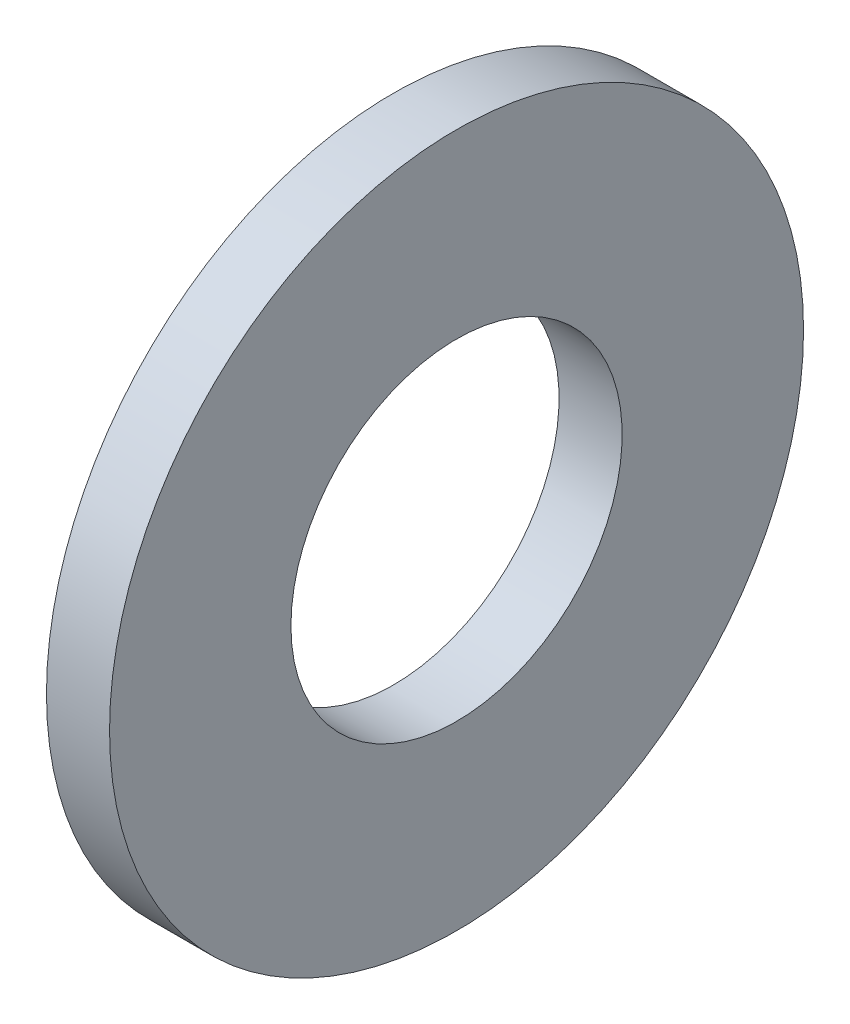
ISO-10303-21;
HEADER;
FILE_DESCRIPTION(('STEP AP214'),'2;1');
FILE_NAME('part.step','',(''),(''),'','','');
FILE_SCHEMA(('AUTOMOTIVE_DESIGN { 1 0 10303 214 1 1 1 1 }'));
ENDSEC;
DATA;
#1=APPLICATION_CONTEXT('core data for automotive mechanical design processes');
#2=APPLICATION_PROTOCOL_DEFINITION('international standard','automotive_design',2000,#1);
#3=PRODUCT_CONTEXT('',#1,'mechanical');
#4=PRODUCT('Part','Part','',(#3));
#5=PRODUCT_RELATED_PRODUCT_CATEGORY('part','',(#4));
#6=PRODUCT_DEFINITION_FORMATION('','',#4);
#7=PRODUCT_DEFINITION_CONTEXT('part definition',#1,'design');
#8=PRODUCT_DEFINITION('design','',#6,#7);
#9=PRODUCT_DEFINITION_SHAPE('','',#8);
#10=(LENGTH_UNIT() NAMED_UNIT(*) SI_UNIT(.MILLI.,.METRE.));
#11=(NAMED_UNIT(*) PLANE_ANGLE_UNIT() SI_UNIT($,.RADIAN.));
#12=(NAMED_UNIT(*) SI_UNIT($,.STERADIAN.) SOLID_ANGLE_UNIT());
#13=UNCERTAINTY_MEASURE_WITH_UNIT(LENGTH_MEASURE(1.E-05),#10,'distance_accuracy_value','');
#14=(GEOMETRIC_REPRESENTATION_CONTEXT(3) GLOBAL_UNCERTAINTY_ASSIGNED_CONTEXT((#13)) GLOBAL_UNIT_ASSIGNED_CONTEXT((#10,
#11,#12)) REPRESENTATION_CONTEXT('',''));
#15=CARTESIAN_POINT('',(0.,0.,0.));
#16=DIRECTION('',(0.,0.,1.));
#17=DIRECTION('',(1.,0.,0.));
#18=AXIS2_PLACEMENT_3D('',#15,#16,#17);
#19=CARTESIAN_POINT('',(0.,0.,-11.));
#20=DIRECTION('',(1.,0.,0.));
#21=DIRECTION('',(0.,0.,-1.));
#22=AXIS2_PLACEMENT_3D('',#19,#20,#21);
#23=PLANE('',#22);
#24=CARTESIAN_POINT('',(0.,0.,0.));
#25=DIRECTION('',(-1.,0.,0.));
#26=DIRECTION('',(0.,0.,1.));
#27=AXIS2_PLACEMENT_3D('',#24,#25,#26);
#28=CIRCLE('',#27,5.25);
#29=CARTESIAN_POINT('',(0.,0.,5.25));
#30=VERTEX_POINT('',#29);
#31=EDGE_CURVE('E10',#30,#30,#28,.T.);
#32=ORIENTED_EDGE('',*,*,#31,.F.);
#33=EDGE_LOOP('',(#32));
#34=FACE_BOUND('',#33,.T.);
#35=CARTESIAN_POINT('',(0.,0.,0.));
#36=DIRECTION('',(-1.,0.,0.));
#37=DIRECTION('',(0.,0.,1.));
#38=AXIS2_PLACEMENT_3D('',#35,#36,#37);
#39=CIRCLE('',#38,11.);
#40=CARTESIAN_POINT('',(0.,0.,11.));
#41=VERTEX_POINT('',#40);
#42=EDGE_CURVE('E39',#41,#41,#39,.T.);
#43=ORIENTED_EDGE('',*,*,#42,.T.);
#44=EDGE_LOOP('',(#43));
#45=FACE_BOUND('',#44,.T.);
#46=ADVANCED_FACE('F25',(#34,#45),#23,.F.);
#47=CARTESIAN_POINT('',(0.,0.,0.));
#48=DIRECTION('',(-1.,0.,0.));
#49=DIRECTION('',(0.,0.,1.));
#50=AXIS2_PLACEMENT_3D('',#47,#48,#49);
#51=CYLINDRICAL_SURFACE('',#50,5.25);
#52=CARTESIAN_POINT('',(2.,0.,0.));
#53=DIRECTION('',(-1.,0.,0.));
#54=DIRECTION('',(0.,0.,1.));
#55=AXIS2_PLACEMENT_3D('',#52,#53,#54);
#56=CIRCLE('',#55,5.25);
#57=CARTESIAN_POINT('',(2.,0.,5.25));
#58=VERTEX_POINT('',#57);
#59=EDGE_CURVE('E31',#58,#58,#56,.T.);
#60=ORIENTED_EDGE('',*,*,#59,.F.);
#61=EDGE_LOOP('',(#60));
#62=FACE_BOUND('',#61,.T.);
#63=ORIENTED_EDGE('',*,*,#31,.T.);
#64=EDGE_LOOP('',(#63));
#65=FACE_BOUND('',#64,.T.);
#66=ADVANCED_FACE('F54',(#62,#65),#51,.F.);
#67=CARTESIAN_POINT('',(2.,0.,-11.));
#68=DIRECTION('',(-1.,0.,0.));
#69=DIRECTION('',(0.,0.,1.));
#70=AXIS2_PLACEMENT_3D('',#67,#68,#69);
#71=PLANE('',#70);
#72=CARTESIAN_POINT('',(2.,0.,0.));
#73=DIRECTION('',(-1.,0.,0.));
#74=DIRECTION('',(0.,0.,1.));
#75=AXIS2_PLACEMENT_3D('',#72,#73,#74);
#76=CIRCLE('',#75,11.);
#77=CARTESIAN_POINT('',(2.,0.,11.));
#78=VERTEX_POINT('',#77);
#79=EDGE_CURVE('E35',#78,#78,#76,.T.);
#80=ORIENTED_EDGE('',*,*,#79,.F.);
#81=EDGE_LOOP('',(#80));
#82=FACE_BOUND('',#81,.T.);
#83=ORIENTED_EDGE('',*,*,#59,.T.);
#84=EDGE_LOOP('',(#83));
#85=FACE_BOUND('',#84,.T.);
#86=ADVANCED_FACE('F49',(#82,#85),#71,.F.);
#87=CARTESIAN_POINT('',(0.,0.,0.));
#88=DIRECTION('',(-1.,0.,0.));
#89=DIRECTION('',(0.,0.,1.));
#90=AXIS2_PLACEMENT_3D('',#87,#88,#89);
#91=CYLINDRICAL_SURFACE('',#90,11.);
#92=ORIENTED_EDGE('',*,*,#42,.F.);
#93=EDGE_LOOP('',(#92));
#94=FACE_BOUND('',#93,.T.);
#95=ORIENTED_EDGE('',*,*,#79,.T.);
#96=EDGE_LOOP('',(#95));
#97=FACE_BOUND('',#96,.T.);
#98=ADVANCED_FACE('F46',(#94,#97),#91,.T.);
#99=CLOSED_SHELL('',(#46,#66,#86,#98));
#100=MANIFOLD_SOLID_BREP('B2',#99);
#101=ADVANCED_BREP_SHAPE_REPRESENTATION('',(#18,#100),#14);
#102=SHAPE_DEFINITION_REPRESENTATION(#9,#101);
ENDSEC;
END-ISO-10303-21;
